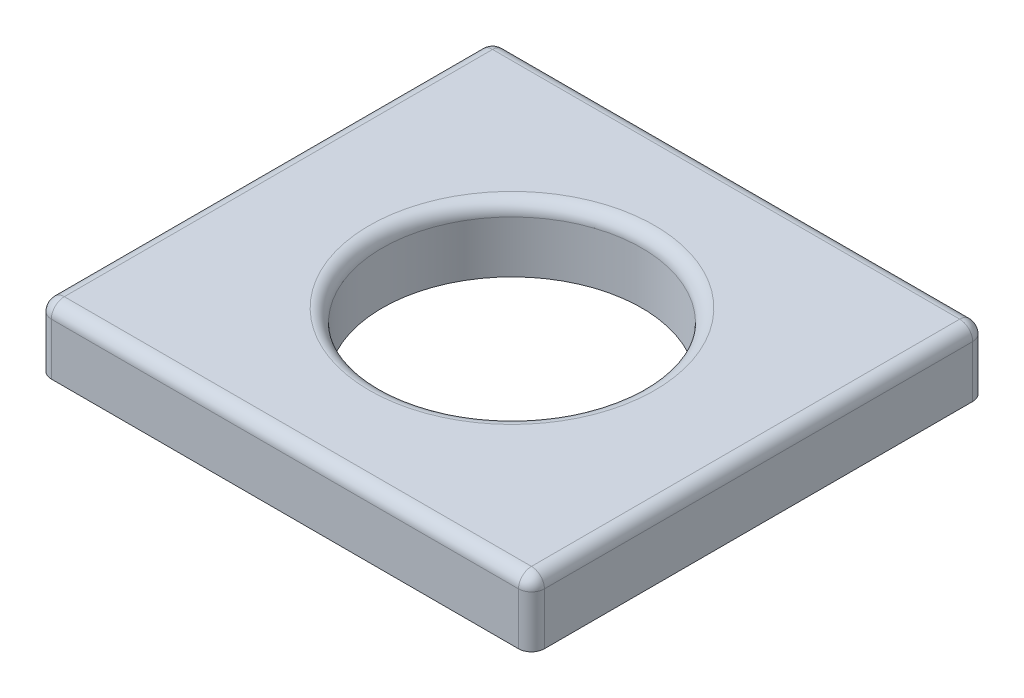
ISO-10303-21;
HEADER;
FILE_DESCRIPTION(('STEP AP214'),'2;1');
FILE_NAME('part.step','',(''),(''),'','','');
FILE_SCHEMA(('AUTOMOTIVE_DESIGN { 1 0 10303 214 1 1 1 1 }'));
ENDSEC;
DATA;
#1=APPLICATION_CONTEXT('core data for automotive mechanical design processes');
#2=APPLICATION_PROTOCOL_DEFINITION('international standard','automotive_design',2000,#1);
#3=PRODUCT_CONTEXT('',#1,'mechanical');
#4=PRODUCT('Part','Part','',(#3));
#5=PRODUCT_RELATED_PRODUCT_CATEGORY('part','',(#4));
#6=PRODUCT_DEFINITION_FORMATION('','',#4);
#7=PRODUCT_DEFINITION_CONTEXT('part definition',#1,'design');
#8=PRODUCT_DEFINITION('design','',#6,#7);
#9=PRODUCT_DEFINITION_SHAPE('','',#8);
#10=(LENGTH_UNIT() NAMED_UNIT(*) SI_UNIT(.MILLI.,.METRE.));
#11=(NAMED_UNIT(*) PLANE_ANGLE_UNIT() SI_UNIT($,.RADIAN.));
#12=(NAMED_UNIT(*) SI_UNIT($,.STERADIAN.) SOLID_ANGLE_UNIT());
#13=UNCERTAINTY_MEASURE_WITH_UNIT(LENGTH_MEASURE(1.E-05),#10,'distance_accuracy_value','');
#14=(GEOMETRIC_REPRESENTATION_CONTEXT(3) GLOBAL_UNCERTAINTY_ASSIGNED_CONTEXT((#13)) GLOBAL_UNIT_ASSIGNED_CONTEXT((#10,
#11,#12)) REPRESENTATION_CONTEXT('',''));
#15=CARTESIAN_POINT('',(0.,0.,0.));
#16=DIRECTION('',(0.,0.,1.));
#17=DIRECTION('',(1.,0.,0.));
#18=AXIS2_PLACEMENT_3D('',#15,#16,#17);
#19=CARTESIAN_POINT('',(3.8,1.,-3.5));
#20=DIRECTION('',(-1.,0.,0.));
#21=DIRECTION('',(0.,0.,1.));
#22=AXIS2_PLACEMENT_3D('',#19,#20,#21);
#23=PLANE('',#22);
#24=DIRECTION('',(0.,0.,-1.));
#25=VECTOR('',#24,1.);
#26=CARTESIAN_POINT('',(3.8,0.,-3.5));
#27=LINE('',#26,#25);
#28=CARTESIAN_POINT('',(3.8,0.,3.3));
#29=VERTEX_POINT('',#28);
#30=CARTESIAN_POINT('',(3.8,0.,-3.3));
#31=VERTEX_POINT('',#30);
#32=EDGE_CURVE('E204',#29,#31,#27,.T.);
#33=ORIENTED_EDGE('',*,*,#32,.T.);
#34=DIRECTION('',(0.,-1.,0.));
#35=VECTOR('',#34,1.);
#36=CARTESIAN_POINT('',(3.8,1.,-3.3));
#37=LINE('',#36,#35);
#38=CARTESIAN_POINT('',(3.8,0.8,-3.3));
#39=VERTEX_POINT('',#38);
#40=EDGE_CURVE('E49',#31,#39,#37,.F.);
#41=ORIENTED_EDGE('',*,*,#40,.T.);
#42=DIRECTION('',(0.,0.,-1.));
#43=VECTOR('',#42,1.);
#44=CARTESIAN_POINT('',(3.8,0.8,3.5));
#45=LINE('',#44,#43);
#46=CARTESIAN_POINT('',(3.8,0.8,3.3));
#47=VERTEX_POINT('',#46);
#48=EDGE_CURVE('E54',#39,#47,#45,.F.);
#49=ORIENTED_EDGE('',*,*,#48,.T.);
#50=DIRECTION('',(0.,-1.,0.));
#51=VECTOR('',#50,1.);
#52=CARTESIAN_POINT('',(3.8,1.,3.3));
#53=LINE('',#52,#51);
#54=EDGE_CURVE('E167',#47,#29,#53,.T.);
#55=ORIENTED_EDGE('',*,*,#54,.T.);
#56=EDGE_LOOP('',(#33,#41,#49,#55));
#57=FACE_BOUND('',#56,.T.);
#58=ADVANCED_FACE('F32',(#57),#23,.F.);
#59=CARTESIAN_POINT('',(-3.8,1.,-3.5));
#60=DIRECTION('',(0.,0.,1.));
#61=DIRECTION('',(1.,0.,0.));
#62=AXIS2_PLACEMENT_3D('',#59,#60,#61);
#63=PLANE('',#62);
#64=DIRECTION('',(-1.,0.,0.));
#65=VECTOR('',#64,1.);
#66=CARTESIAN_POINT('',(3.8,0.8,-3.5));
#67=LINE('',#66,#65);
#68=CARTESIAN_POINT('',(-3.6,0.8,-3.5));
#69=VERTEX_POINT('',#68);
#70=CARTESIAN_POINT('',(3.6,0.8,-3.5));
#71=VERTEX_POINT('',#70);
#72=EDGE_CURVE('E163',#69,#71,#67,.F.);
#73=ORIENTED_EDGE('',*,*,#72,.T.);
#74=DIRECTION('',(0.,-1.,0.));
#75=VECTOR('',#74,1.);
#76=CARTESIAN_POINT('',(3.6,1.,-3.5));
#77=LINE('',#76,#75);
#78=CARTESIAN_POINT('',(3.6,0.,-3.5));
#79=VERTEX_POINT('',#78);
#80=EDGE_CURVE('E165',#71,#79,#77,.T.);
#81=ORIENTED_EDGE('',*,*,#80,.T.);
#82=DIRECTION('',(-1.,0.,0.));
#83=VECTOR('',#82,1.);
#84=CARTESIAN_POINT('',(-3.8,0.,-3.5));
#85=LINE('',#84,#83);
#86=CARTESIAN_POINT('',(-3.6,0.,-3.5));
#87=VERTEX_POINT('',#86);
#88=EDGE_CURVE('E208',#79,#87,#85,.T.);
#89=ORIENTED_EDGE('',*,*,#88,.T.);
#90=DIRECTION('',(0.,-1.,0.));
#91=VECTOR('',#90,1.);
#92=CARTESIAN_POINT('',(-3.6,1.,-3.5));
#93=LINE('',#92,#91);
#94=EDGE_CURVE('E161',#87,#69,#93,.F.);
#95=ORIENTED_EDGE('',*,*,#94,.T.);
#96=EDGE_LOOP('',(#73,#81,#89,#95));
#97=FACE_BOUND('',#96,.T.);
#98=ADVANCED_FACE('F263',(#97),#63,.F.);
#99=CARTESIAN_POINT('',(-3.8,1.,-3.5));
#100=DIRECTION('',(1.,0.,0.));
#101=DIRECTION('',(0.,0.,-1.));
#102=AXIS2_PLACEMENT_3D('',#99,#100,#101);
#103=PLANE('',#102);
#104=DIRECTION('',(0.,0.,1.));
#105=VECTOR('',#104,1.);
#106=CARTESIAN_POINT('',(-3.8,0.,-3.5));
#107=LINE('',#106,#105);
#108=CARTESIAN_POINT('',(-3.8,0.,-3.3));
#109=VERTEX_POINT('',#108);
#110=CARTESIAN_POINT('',(-3.8,0.,3.3));
#111=VERTEX_POINT('',#110);
#112=EDGE_CURVE('E213',#109,#111,#107,.T.);
#113=ORIENTED_EDGE('',*,*,#112,.T.);
#114=DIRECTION('',(0.,-1.,0.));
#115=VECTOR('',#114,1.);
#116=CARTESIAN_POINT('',(-3.8,1.,3.3));
#117=LINE('',#116,#115);
#118=CARTESIAN_POINT('',(-3.8,0.8,3.3));
#119=VERTEX_POINT('',#118);
#120=EDGE_CURVE('E159',#111,#119,#117,.F.);
#121=ORIENTED_EDGE('',*,*,#120,.T.);
#122=DIRECTION('',(0.,0.,1.));
#123=VECTOR('',#122,1.);
#124=CARTESIAN_POINT('',(-3.8,0.8,-3.5));
#125=LINE('',#124,#123);
#126=CARTESIAN_POINT('',(-3.8,0.8,-3.3));
#127=VERTEX_POINT('',#126);
#128=EDGE_CURVE('E157',#119,#127,#125,.F.);
#129=ORIENTED_EDGE('',*,*,#128,.T.);
#130=DIRECTION('',(0.,-1.,0.));
#131=VECTOR('',#130,1.);
#132=CARTESIAN_POINT('',(-3.8,1.,-3.3));
#133=LINE('',#132,#131);
#134=EDGE_CURVE('E155',#127,#109,#133,.T.);
#135=ORIENTED_EDGE('',*,*,#134,.T.);
#136=EDGE_LOOP('',(#113,#121,#129,#135));
#137=FACE_BOUND('',#136,.T.);
#138=ADVANCED_FACE('F268',(#137),#103,.F.);
#139=CARTESIAN_POINT('',(-3.8,1.,3.5));
#140=DIRECTION('',(0.,0.,-1.));
#141=DIRECTION('',(-1.,0.,0.));
#142=AXIS2_PLACEMENT_3D('',#139,#140,#141);
#143=PLANE('',#142);
#144=DIRECTION('',(1.,0.,0.));
#145=VECTOR('',#144,1.);
#146=CARTESIAN_POINT('',(-3.8,0.,3.5));
#147=LINE('',#146,#145);
#148=CARTESIAN_POINT('',(-3.6,0.,3.5));
#149=VERTEX_POINT('',#148);
#150=CARTESIAN_POINT('',(3.6,0.,3.5));
#151=VERTEX_POINT('',#150);
#152=EDGE_CURVE('E216',#149,#151,#147,.T.);
#153=ORIENTED_EDGE('',*,*,#152,.T.);
#154=DIRECTION('',(0.,-1.,0.));
#155=VECTOR('',#154,1.);
#156=CARTESIAN_POINT('',(3.6,1.,3.5));
#157=LINE('',#156,#155);
#158=CARTESIAN_POINT('',(3.6,0.8,3.5));
#159=VERTEX_POINT('',#158);
#160=EDGE_CURVE('E153',#151,#159,#157,.F.);
#161=ORIENTED_EDGE('',*,*,#160,.T.);
#162=DIRECTION('',(1.,0.,0.));
#163=VECTOR('',#162,1.);
#164=CARTESIAN_POINT('',(-3.8,0.8,3.5));
#165=LINE('',#164,#163);
#166=CARTESIAN_POINT('',(-3.6,0.8,3.5));
#167=VERTEX_POINT('',#166);
#168=EDGE_CURVE('E117',#159,#167,#165,.F.);
#169=ORIENTED_EDGE('',*,*,#168,.T.);
#170=DIRECTION('',(0.,-1.,0.));
#171=VECTOR('',#170,1.);
#172=CARTESIAN_POINT('',(-3.6,1.,3.5));
#173=LINE('',#172,#171);
#174=EDGE_CURVE('E146',#167,#149,#173,.T.);
#175=ORIENTED_EDGE('',*,*,#174,.T.);
#176=EDGE_LOOP('',(#153,#161,#169,#175));
#177=FACE_BOUND('',#176,.T.);
#178=ADVANCED_FACE('F239',(#177),#143,.F.);
#179=CARTESIAN_POINT('',(0.,1.,0.));
#180=DIRECTION('',(0.,1.,0.));
#181=DIRECTION('',(0.,0.,1.));
#182=AXIS2_PLACEMENT_3D('',#179,#180,#181);
#183=PLANE('',#182);
#184=DIRECTION('',(0.,0.,1.));
#185=VECTOR('',#184,1.);
#186=CARTESIAN_POINT('',(-3.6,1.,3.5));
#187=LINE('',#186,#185);
#188=CARTESIAN_POINT('',(-3.6,1.,-3.3));
#189=VERTEX_POINT('',#188);
#190=CARTESIAN_POINT('',(-3.6,1.,3.3));
#191=VERTEX_POINT('',#190);
#192=EDGE_CURVE('E144',#189,#191,#187,.T.);
#193=ORIENTED_EDGE('',*,*,#192,.T.);
#194=DIRECTION('',(1.,0.,0.));
#195=VECTOR('',#194,1.);
#196=CARTESIAN_POINT('',(3.8,1.,3.3));
#197=LINE('',#196,#195);
#198=CARTESIAN_POINT('',(3.6,1.,3.3));
#199=VERTEX_POINT('',#198);
#200=EDGE_CURVE('E115',#191,#199,#197,.T.);
#201=ORIENTED_EDGE('',*,*,#200,.T.);
#202=DIRECTION('',(0.,0.,-1.));
#203=VECTOR('',#202,1.);
#204=CARTESIAN_POINT('',(3.6,1.,-3.5));
#205=LINE('',#204,#203);
#206=CARTESIAN_POINT('',(3.6,1.,-3.3));
#207=VERTEX_POINT('',#206);
#208=EDGE_CURVE('E132',#199,#207,#205,.T.);
#209=ORIENTED_EDGE('',*,*,#208,.T.);
#210=DIRECTION('',(-1.,0.,0.));
#211=VECTOR('',#210,1.);
#212=CARTESIAN_POINT('',(-3.8,1.,-3.3));
#213=LINE('',#212,#211);
#214=EDGE_CURVE('E138',#207,#189,#213,.T.);
#215=ORIENTED_EDGE('',*,*,#214,.T.);
#216=EDGE_LOOP('',(#193,#201,#209,#215));
#217=FACE_BOUND('',#216,.T.);
#218=CARTESIAN_POINT('',(0.,1.,0.));
#219=DIRECTION('',(0.,1.,0.));
#220=DIRECTION('',(0.,0.,1.));
#221=AXIS2_PLACEMENT_3D('',#218,#219,#220);
#222=CIRCLE('',#221,2.2);
#223=CARTESIAN_POINT('',(0.,1.,2.2));
#224=VERTEX_POINT('',#223);
#225=EDGE_CURVE('E139',#224,#224,#222,.F.);
#226=ORIENTED_EDGE('',*,*,#225,.T.);
#227=EDGE_LOOP('',(#226));
#228=FACE_BOUND('',#227,.T.);
#229=ADVANCED_FACE('F141',(#217,#228),#183,.T.);
#230=CARTESIAN_POINT('',(0.,0.,0.));
#231=DIRECTION('',(0.,1.,0.));
#232=DIRECTION('',(0.,0.,1.));
#233=AXIS2_PLACEMENT_3D('',#230,#231,#232);
#234=PLANE('',#233);
#235=CARTESIAN_POINT('',(0.,0.,0.));
#236=DIRECTION('',(0.,1.,0.));
#237=DIRECTION('',(0.,0.,1.));
#238=AXIS2_PLACEMENT_3D('',#235,#236,#237);
#239=CIRCLE('',#238,2.);
#240=CARTESIAN_POINT('',(0.,0.,2.));
#241=VERTEX_POINT('',#240);
#242=EDGE_CURVE('E201',#241,#241,#239,.T.);
#243=ORIENTED_EDGE('',*,*,#242,.T.);
#244=EDGE_LOOP('',(#243));
#245=FACE_BOUND('',#244,.T.);
#246=ORIENTED_EDGE('',*,*,#88,.F.);
#247=CARTESIAN_POINT('',(3.6,0.,-3.3));
#248=DIRECTION('',(0.,1.,0.));
#249=DIRECTION('',(0.,0.,1.));
#250=AXIS2_PLACEMENT_3D('',#247,#248,#249);
#251=CIRCLE('',#250,0.2);
#252=EDGE_CURVE('E11',#79,#31,#251,.F.);
#253=ORIENTED_EDGE('',*,*,#252,.T.);
#254=ORIENTED_EDGE('',*,*,#32,.F.);
#255=CARTESIAN_POINT('',(3.6,0.,3.3));
#256=DIRECTION('',(0.,1.,0.));
#257=DIRECTION('',(0.,0.,1.));
#258=AXIS2_PLACEMENT_3D('',#255,#256,#257);
#259=CIRCLE('',#258,0.2);
#260=EDGE_CURVE('E41',#29,#151,#259,.F.);
#261=ORIENTED_EDGE('',*,*,#260,.T.);
#262=ORIENTED_EDGE('',*,*,#152,.F.);
#263=CARTESIAN_POINT('',(-3.6,0.,3.3));
#264=DIRECTION('',(0.,1.,0.));
#265=DIRECTION('',(0.,0.,1.));
#266=AXIS2_PLACEMENT_3D('',#263,#264,#265);
#267=CIRCLE('',#266,0.2);
#268=EDGE_CURVE('E176',#149,#111,#267,.F.);
#269=ORIENTED_EDGE('',*,*,#268,.T.);
#270=ORIENTED_EDGE('',*,*,#112,.F.);
#271=CARTESIAN_POINT('',(-3.6,0.,-3.3));
#272=DIRECTION('',(0.,1.,0.));
#273=DIRECTION('',(0.,0.,1.));
#274=AXIS2_PLACEMENT_3D('',#271,#272,#273);
#275=CIRCLE('',#274,0.2);
#276=EDGE_CURVE('E174',#109,#87,#275,.F.);
#277=ORIENTED_EDGE('',*,*,#276,.T.);
#278=EDGE_LOOP('',(#246,#253,#254,#261,#262,#269,#270,#277));
#279=FACE_BOUND('',#278,.T.);
#280=ADVANCED_FACE('F247',(#245,#279),#234,.F.);
#281=CARTESIAN_POINT('',(0.,0.,0.));
#282=DIRECTION('',(0.,1.,0.));
#283=DIRECTION('',(0.,0.,1.));
#284=AXIS2_PLACEMENT_3D('',#281,#282,#283);
#285=CYLINDRICAL_SURFACE('',#284,2.);
#286=CARTESIAN_POINT('',(0.,0.8,0.));
#287=DIRECTION('',(0.,1.,0.));
#288=DIRECTION('',(0.,0.,1.));
#289=AXIS2_PLACEMENT_3D('',#286,#287,#288);
#290=CIRCLE('',#289,2.);
#291=CARTESIAN_POINT('',(0.,0.8,2.));
#292=VERTEX_POINT('',#291);
#293=EDGE_CURVE('E171',#292,#292,#290,.T.);
#294=ORIENTED_EDGE('',*,*,#293,.T.);
#295=EDGE_LOOP('',(#294));
#296=FACE_BOUND('',#295,.T.);
#297=ORIENTED_EDGE('',*,*,#242,.F.);
#298=EDGE_LOOP('',(#297));
#299=FACE_BOUND('',#298,.T.);
#300=ADVANCED_FACE('F364',(#296,#299),#285,.F.);
#301=CARTESIAN_POINT('',(-3.6,1.,-3.3));
#302=DIRECTION('',(0.,-1.,0.));
#303=DIRECTION('',(0.,0.,-1.));
#304=AXIS2_PLACEMENT_3D('',#301,#302,#303);
#305=CYLINDRICAL_SURFACE('',#304,0.2);
#306=ORIENTED_EDGE('',*,*,#276,.F.);
#307=ORIENTED_EDGE('',*,*,#134,.F.);
#308=CARTESIAN_POINT('',(-3.6,0.8,-3.3));
#309=DIRECTION('',(0.,1.,0.));
#310=DIRECTION('',(0.,0.,1.));
#311=AXIS2_PLACEMENT_3D('',#308,#309,#310);
#312=CIRCLE('',#311,0.2);
#313=EDGE_CURVE('E36',#69,#127,#312,.T.);
#314=ORIENTED_EDGE('',*,*,#313,.F.);
#315=ORIENTED_EDGE('',*,*,#94,.F.);
#316=EDGE_LOOP('',(#306,#307,#314,#315));
#317=FACE_BOUND('',#316,.T.);
#318=ADVANCED_FACE('F356',(#317),#305,.T.);
#319=CARTESIAN_POINT('',(0.,0.8,-3.3));
#320=DIRECTION('',(1.,0.,0.));
#321=DIRECTION('',(0.,0.,-1.));
#322=AXIS2_PLACEMENT_3D('',#319,#320,#321);
#323=CYLINDRICAL_SURFACE('',#322,0.2);
#324=CARTESIAN_POINT('',(3.6,0.8,-3.3));
#325=DIRECTION('',(1.,0.,0.));
#326=DIRECTION('',(0.,1.,0.));
#327=AXIS2_PLACEMENT_3D('',#324,#325,#326);
#328=CIRCLE('',#327,0.2);
#329=EDGE_CURVE('E193',#71,#207,#328,.T.);
#330=ORIENTED_EDGE('',*,*,#329,.F.);
#331=ORIENTED_EDGE('',*,*,#72,.F.);
#332=CARTESIAN_POINT('',(-3.6,0.8,-3.3));
#333=DIRECTION('',(-1.,0.,0.));
#334=DIRECTION('',(0.,0.,1.));
#335=AXIS2_PLACEMENT_3D('',#332,#333,#334);
#336=CIRCLE('',#335,0.2);
#337=EDGE_CURVE('E195',#189,#69,#336,.T.);
#338=ORIENTED_EDGE('',*,*,#337,.F.);
#339=ORIENTED_EDGE('',*,*,#214,.F.);
#340=EDGE_LOOP('',(#330,#331,#338,#339));
#341=FACE_BOUND('',#340,.T.);
#342=ADVANCED_FACE('F223',(#341),#323,.T.);
#343=CARTESIAN_POINT('',(3.6,1.,-3.3));
#344=DIRECTION('',(0.,-1.,0.));
#345=DIRECTION('',(0.,0.,-1.));
#346=AXIS2_PLACEMENT_3D('',#343,#344,#345);
#347=CYLINDRICAL_SURFACE('',#346,0.2);
#348=ORIENTED_EDGE('',*,*,#252,.F.);
#349=ORIENTED_EDGE('',*,*,#80,.F.);
#350=CARTESIAN_POINT('',(3.6,0.8,-3.3));
#351=DIRECTION('',(0.,1.,0.));
#352=DIRECTION('',(0.,0.,1.));
#353=AXIS2_PLACEMENT_3D('',#350,#351,#352);
#354=CIRCLE('',#353,0.2);
#355=EDGE_CURVE('E190',#39,#71,#354,.T.);
#356=ORIENTED_EDGE('',*,*,#355,.F.);
#357=ORIENTED_EDGE('',*,*,#40,.F.);
#358=EDGE_LOOP('',(#348,#349,#356,#357));
#359=FACE_BOUND('',#358,.T.);
#360=ADVANCED_FACE('F251',(#359),#347,.T.);
#361=CARTESIAN_POINT('',(-3.6,0.8,-3.3));
#362=DIRECTION('',(0.,0.,1.));
#363=DIRECTION('',(1.,0.,0.));
#364=AXIS2_PLACEMENT_3D('',#361,#362,#363);
#365=SPHERICAL_SURFACE('',#364,0.2);
#366=ORIENTED_EDGE('',*,*,#337,.T.);
#367=ORIENTED_EDGE('',*,*,#313,.T.);
#368=CARTESIAN_POINT('',(-3.6,0.8,-3.3));
#369=DIRECTION('',(0.,0.,-1.));
#370=DIRECTION('',(-1.,0.,0.));
#371=AXIS2_PLACEMENT_3D('',#368,#369,#370);
#372=CIRCLE('',#371,0.2);
#373=EDGE_CURVE('E187',#189,#127,#372,.F.);
#374=ORIENTED_EDGE('',*,*,#373,.F.);
#375=EDGE_LOOP('',(#366,#367,#374));
#376=FACE_BOUND('',#375,.T.);
#377=ADVANCED_FACE('F224',(#376),#365,.T.);
#378=CARTESIAN_POINT('',(3.6,0.8,-3.3));
#379=DIRECTION('',(0.,0.,1.));
#380=DIRECTION('',(1.,0.,0.));
#381=AXIS2_PLACEMENT_3D('',#378,#379,#380);
#382=SPHERICAL_SURFACE('',#381,0.2);
#383=ORIENTED_EDGE('',*,*,#355,.T.);
#384=ORIENTED_EDGE('',*,*,#329,.T.);
#385=CARTESIAN_POINT('',(3.6,0.8,-3.3));
#386=DIRECTION('',(0.,0.,-1.));
#387=DIRECTION('',(-1.,0.,0.));
#388=AXIS2_PLACEMENT_3D('',#385,#386,#387);
#389=CIRCLE('',#388,0.2);
#390=EDGE_CURVE('E135',#39,#207,#389,.F.);
#391=ORIENTED_EDGE('',*,*,#390,.F.);
#392=EDGE_LOOP('',(#383,#384,#391));
#393=FACE_BOUND('',#392,.T.);
#394=ADVANCED_FACE('F253',(#393),#382,.T.);
#395=CARTESIAN_POINT('',(-3.6,1.,3.3));
#396=DIRECTION('',(0.,-1.,0.));
#397=DIRECTION('',(0.,0.,-1.));
#398=AXIS2_PLACEMENT_3D('',#395,#396,#397);
#399=CYLINDRICAL_SURFACE('',#398,0.2);
#400=ORIENTED_EDGE('',*,*,#268,.F.);
#401=ORIENTED_EDGE('',*,*,#174,.F.);
#402=CARTESIAN_POINT('',(-3.6,0.8,3.3));
#403=DIRECTION('',(0.,1.,0.));
#404=DIRECTION('',(0.,0.,1.));
#405=AXIS2_PLACEMENT_3D('',#402,#403,#404);
#406=CIRCLE('',#405,0.2);
#407=EDGE_CURVE('E183',#119,#167,#406,.T.);
#408=ORIENTED_EDGE('',*,*,#407,.F.);
#409=ORIENTED_EDGE('',*,*,#120,.F.);
#410=EDGE_LOOP('',(#400,#401,#408,#409));
#411=FACE_BOUND('',#410,.T.);
#412=ADVANCED_FACE('F236',(#411),#399,.T.);
#413=CARTESIAN_POINT('',(-3.6,0.8,0.));
#414=DIRECTION('',(0.,0.,-1.));
#415=DIRECTION('',(-1.,0.,0.));
#416=AXIS2_PLACEMENT_3D('',#413,#414,#415);
#417=CYLINDRICAL_SURFACE('',#416,0.2);
#418=ORIENTED_EDGE('',*,*,#373,.T.);
#419=ORIENTED_EDGE('',*,*,#128,.F.);
#420=CARTESIAN_POINT('',(-3.6,0.8,3.3));
#421=DIRECTION('',(0.,0.,1.));
#422=DIRECTION('',(1.,0.,0.));
#423=AXIS2_PLACEMENT_3D('',#420,#421,#422);
#424=CIRCLE('',#423,0.2);
#425=EDGE_CURVE('E129',#191,#119,#424,.T.);
#426=ORIENTED_EDGE('',*,*,#425,.F.);
#427=ORIENTED_EDGE('',*,*,#192,.F.);
#428=EDGE_LOOP('',(#418,#419,#426,#427));
#429=FACE_BOUND('',#428,.T.);
#430=ADVANCED_FACE('F227',(#429),#417,.T.);
#431=CARTESIAN_POINT('',(3.6,0.8,0.));
#432=DIRECTION('',(0.,0.,1.));
#433=DIRECTION('',(1.,0.,0.));
#434=AXIS2_PLACEMENT_3D('',#431,#432,#433);
#435=CYLINDRICAL_SURFACE('',#434,0.2);
#436=ORIENTED_EDGE('',*,*,#390,.T.);
#437=ORIENTED_EDGE('',*,*,#208,.F.);
#438=CARTESIAN_POINT('',(3.6,0.8,3.3));
#439=DIRECTION('',(0.,0.,1.));
#440=DIRECTION('',(0.,-1.,0.));
#441=AXIS2_PLACEMENT_3D('',#438,#439,#440);
#442=CIRCLE('',#441,0.2);
#443=EDGE_CURVE('E123',#47,#199,#442,.T.);
#444=ORIENTED_EDGE('',*,*,#443,.F.);
#445=ORIENTED_EDGE('',*,*,#48,.F.);
#446=EDGE_LOOP('',(#436,#437,#444,#445));
#447=FACE_BOUND('',#446,.T.);
#448=ADVANCED_FACE('F133',(#447),#435,.T.);
#449=CARTESIAN_POINT('',(3.6,1.,3.3));
#450=DIRECTION('',(0.,-1.,0.));
#451=DIRECTION('',(0.,0.,-1.));
#452=AXIS2_PLACEMENT_3D('',#449,#450,#451);
#453=CYLINDRICAL_SURFACE('',#452,0.2);
#454=ORIENTED_EDGE('',*,*,#260,.F.);
#455=ORIENTED_EDGE('',*,*,#54,.F.);
#456=CARTESIAN_POINT('',(3.6,0.8,3.3));
#457=DIRECTION('',(0.,1.,0.));
#458=DIRECTION('',(0.,0.,1.));
#459=AXIS2_PLACEMENT_3D('',#456,#457,#458);
#460=CIRCLE('',#459,0.2);
#461=EDGE_CURVE('E127',#159,#47,#460,.T.);
#462=ORIENTED_EDGE('',*,*,#461,.F.);
#463=ORIENTED_EDGE('',*,*,#160,.F.);
#464=EDGE_LOOP('',(#454,#455,#462,#463));
#465=FACE_BOUND('',#464,.T.);
#466=ADVANCED_FACE('F243',(#465),#453,.T.);
#467=CARTESIAN_POINT('',(-3.6,0.8,3.3));
#468=DIRECTION('',(0.,0.,1.));
#469=DIRECTION('',(1.,0.,0.));
#470=AXIS2_PLACEMENT_3D('',#467,#468,#469);
#471=SPHERICAL_SURFACE('',#470,0.2);
#472=ORIENTED_EDGE('',*,*,#425,.T.);
#473=ORIENTED_EDGE('',*,*,#407,.T.);
#474=CARTESIAN_POINT('',(-3.6,0.8,3.3));
#475=DIRECTION('',(-1.,0.,0.));
#476=DIRECTION('',(0.,0.,1.));
#477=AXIS2_PLACEMENT_3D('',#474,#475,#476);
#478=CIRCLE('',#477,0.2);
#479=EDGE_CURVE('E120',#191,#167,#478,.F.);
#480=ORIENTED_EDGE('',*,*,#479,.F.);
#481=EDGE_LOOP('',(#472,#473,#480));
#482=FACE_BOUND('',#481,.T.);
#483=ADVANCED_FACE('F231',(#482),#471,.T.);
#484=CARTESIAN_POINT('',(3.6,0.8,3.3));
#485=DIRECTION('',(0.,0.,1.));
#486=DIRECTION('',(1.,0.,0.));
#487=AXIS2_PLACEMENT_3D('',#484,#485,#486);
#488=SPHERICAL_SURFACE('',#487,0.2);
#489=ORIENTED_EDGE('',*,*,#461,.T.);
#490=ORIENTED_EDGE('',*,*,#443,.T.);
#491=CARTESIAN_POINT('',(3.6,0.8,3.3));
#492=DIRECTION('',(1.,0.,0.));
#493=DIRECTION('',(0.,0.,-1.));
#494=AXIS2_PLACEMENT_3D('',#491,#492,#493);
#495=CIRCLE('',#494,0.2);
#496=EDGE_CURVE('E111',#159,#199,#495,.F.);
#497=ORIENTED_EDGE('',*,*,#496,.F.);
#498=EDGE_LOOP('',(#489,#490,#497));
#499=FACE_BOUND('',#498,.T.);
#500=ADVANCED_FACE('F125',(#499),#488,.T.);
#501=CARTESIAN_POINT('',(0.,0.8,3.3));
#502=DIRECTION('',(-1.,0.,0.));
#503=DIRECTION('',(0.,0.,1.));
#504=AXIS2_PLACEMENT_3D('',#501,#502,#503);
#505=CYLINDRICAL_SURFACE('',#504,0.2);
#506=ORIENTED_EDGE('',*,*,#479,.T.);
#507=ORIENTED_EDGE('',*,*,#168,.F.);
#508=ORIENTED_EDGE('',*,*,#496,.T.);
#509=ORIENTED_EDGE('',*,*,#200,.F.);
#510=EDGE_LOOP('',(#506,#507,#508,#509));
#511=FACE_BOUND('',#510,.T.);
#512=ADVANCED_FACE('F113',(#511),#505,.T.);
#513=CARTESIAN_POINT('',(0.,0.8,0.));
#514=DIRECTION('',(0.,1.,0.));
#515=DIRECTION('',(0.,0.,1.));
#516=AXIS2_PLACEMENT_3D('',#513,#514,#515);
#517=TOROIDAL_SURFACE('',#516,2.2,0.2);
#518=ORIENTED_EDGE('',*,*,#225,.F.);
#519=EDGE_LOOP('',(#518));
#520=FACE_BOUND('',#519,.T.);
#521=ORIENTED_EDGE('',*,*,#293,.F.);
#522=EDGE_LOOP('',(#521));
#523=FACE_BOUND('',#522,.T.);
#524=ADVANCED_FACE('F34',(#520,#523),#517,.T.);
#525=CLOSED_SHELL('',(#58,#98,#138,#178,#229,#280,#300,#318,#342,#360,#377,#394,#412,#430,#448,
#466,#483,#500,#512,#524));
#526=MANIFOLD_SOLID_BREP('B2',#525);
#527=ADVANCED_BREP_SHAPE_REPRESENTATION('',(#18,#526),#14);
#528=SHAPE_DEFINITION_REPRESENTATION(#9,#527);
ENDSEC;
END-ISO-10303-21;
